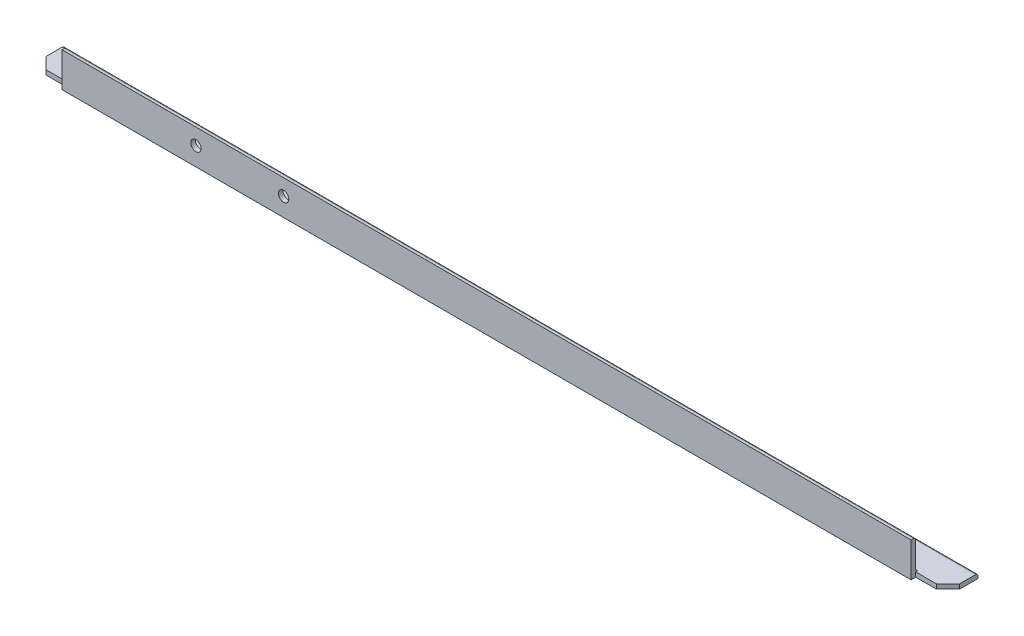
ISO-10303-21;
HEADER;
FILE_DESCRIPTION(('STEP AP214'),'2;1');
FILE_NAME('part.step','',(''),(''),'','','');
FILE_SCHEMA(('AUTOMOTIVE_DESIGN { 1 0 10303 214 1 1 1 1 }'));
ENDSEC;
DATA;
#1=APPLICATION_CONTEXT('core data for automotive mechanical design processes');
#2=APPLICATION_PROTOCOL_DEFINITION('international standard','automotive_design',2000,#1);
#3=PRODUCT_CONTEXT('',#1,'mechanical');
#4=PRODUCT('Part','Part','',(#3));
#5=PRODUCT_RELATED_PRODUCT_CATEGORY('part','',(#4));
#6=PRODUCT_DEFINITION_FORMATION('','',#4);
#7=PRODUCT_DEFINITION_CONTEXT('part definition',#1,'design');
#8=PRODUCT_DEFINITION('design','',#6,#7);
#9=PRODUCT_DEFINITION_SHAPE('','',#8);
#10=(LENGTH_UNIT() NAMED_UNIT(*) SI_UNIT(.MILLI.,.METRE.));
#11=(NAMED_UNIT(*) PLANE_ANGLE_UNIT() SI_UNIT($,.RADIAN.));
#12=(NAMED_UNIT(*) SI_UNIT($,.STERADIAN.) SOLID_ANGLE_UNIT());
#13=UNCERTAINTY_MEASURE_WITH_UNIT(LENGTH_MEASURE(1.E-05),#10,'distance_accuracy_value','');
#14=(GEOMETRIC_REPRESENTATION_CONTEXT(3) GLOBAL_UNCERTAINTY_ASSIGNED_CONTEXT((#13)) GLOBAL_UNIT_ASSIGNED_CONTEXT((#10,
#11,#12)) REPRESENTATION_CONTEXT('',''));
#15=CARTESIAN_POINT('',(0.,0.,0.));
#16=DIRECTION('',(0.,0.,1.));
#17=DIRECTION('',(1.,0.,0.));
#18=AXIS2_PLACEMENT_3D('',#15,#16,#17);
#19=CARTESIAN_POINT('',(396.,3.,-3.));
#20=DIRECTION('',(-1.,0.,0.));
#21=DIRECTION('',(0.,0.,1.));
#22=AXIS2_PLACEMENT_3D('',#19,#20,#21);
#23=CYLINDRICAL_SURFACE('',#22,1.);
#24=DIRECTION('',(-1.,0.,0.));
#25=VECTOR('',#24,1.);
#26=CARTESIAN_POINT('',(396.,2.,-3.));
#27=LINE('',#26,#25);
#28=CARTESIAN_POINT('',(382.,2.,-3.00000000000001));
#29=VERTEX_POINT('',#28);
#30=CARTESIAN_POINT('',(14.,2.,-3.));
#31=VERTEX_POINT('',#30);
#32=EDGE_CURVE('E194',#29,#31,#27,.T.);
#33=ORIENTED_EDGE('',*,*,#32,.T.);
#34=CARTESIAN_POINT('',(14.,3.,-3.));
#35=DIRECTION('',(1.,0.,0.));
#36=DIRECTION('',(0.,0.,-1.));
#37=AXIS2_PLACEMENT_3D('',#34,#35,#36);
#38=CIRCLE('',#37,1.);
#39=CARTESIAN_POINT('',(14.,3.,-2.));
#40=VERTEX_POINT('',#39);
#41=EDGE_CURVE('E262',#31,#40,#38,.F.);
#42=ORIENTED_EDGE('',*,*,#41,.T.);
#43=DIRECTION('',(-1.,0.,0.));
#44=VECTOR('',#43,1.);
#45=CARTESIAN_POINT('',(396.,3.,-2.));
#46=LINE('',#45,#44);
#47=CARTESIAN_POINT('',(382.,3.,-2.));
#48=VERTEX_POINT('',#47);
#49=EDGE_CURVE('E191',#48,#40,#46,.T.);
#50=ORIENTED_EDGE('',*,*,#49,.F.);
#51=CARTESIAN_POINT('',(382.,3.,-3.));
#52=DIRECTION('',(1.,0.,0.));
#53=DIRECTION('',(0.,0.,-1.));
#54=AXIS2_PLACEMENT_3D('',#51,#52,#53);
#55=CIRCLE('',#54,1.);
#56=EDGE_CURVE('E169',#29,#48,#55,.F.);
#57=ORIENTED_EDGE('',*,*,#56,.F.);
#58=EDGE_LOOP('',(#33,#42,#50,#57));
#59=FACE_BOUND('',#58,.T.);
#60=ADVANCED_FACE('F33',(#59),#23,.F.);
#61=CARTESIAN_POINT('',(396.,14.,-2.));
#62=DIRECTION('',(0.,0.,1.));
#63=DIRECTION('',(0.,-1.,0.));
#64=AXIS2_PLACEMENT_3D('',#61,#62,#63);
#65=PLANE('',#64);
#66=CARTESIAN_POINT('',(110.,8.,-2.));
#67=DIRECTION('',(0.,0.,-1.));
#68=DIRECTION('',(0.,1.,0.));
#69=AXIS2_PLACEMENT_3D('',#66,#67,#68);
#70=CIRCLE('',#69,2.25);
#71=CARTESIAN_POINT('',(110.,10.25,-2.));
#72=VERTEX_POINT('',#71);
#73=EDGE_CURVE('E520',#72,#72,#70,.T.);
#74=ORIENTED_EDGE('',*,*,#73,.F.);
#75=EDGE_LOOP('',(#74));
#76=FACE_BOUND('',#75,.T.);
#77=CARTESIAN_POINT('',(72.,8.,-2.));
#78=DIRECTION('',(0.,0.,-1.));
#79=DIRECTION('',(0.,1.,0.));
#80=AXIS2_PLACEMENT_3D('',#77,#78,#79);
#81=CIRCLE('',#80,2.25);
#82=CARTESIAN_POINT('',(72.,10.25,-2.));
#83=VERTEX_POINT('',#82);
#84=EDGE_CURVE('E522',#83,#83,#81,.T.);
#85=ORIENTED_EDGE('',*,*,#84,.F.);
#86=EDGE_LOOP('',(#85));
#87=FACE_BOUND('',#86,.T.);
#88=ORIENTED_EDGE('',*,*,#49,.T.);
#89=DIRECTION('',(0.,1.,0.));
#90=VECTOR('',#89,1.);
#91=CARTESIAN_POINT('',(14.,14.,-2.));
#92=LINE('',#91,#90);
#93=CARTESIAN_POINT('',(14.,14.,-2.));
#94=VERTEX_POINT('',#93);
#95=EDGE_CURVE('E267',#40,#94,#92,.T.);
#96=ORIENTED_EDGE('',*,*,#95,.T.);
#97=DIRECTION('',(-1.,0.,0.));
#98=VECTOR('',#97,1.);
#99=CARTESIAN_POINT('',(396.,14.,-2.));
#100=LINE('',#99,#98);
#101=CARTESIAN_POINT('',(382.,14.,-2.));
#102=VERTEX_POINT('',#101);
#103=EDGE_CURVE('E188',#102,#94,#100,.T.);
#104=ORIENTED_EDGE('',*,*,#103,.F.);
#105=DIRECTION('',(0.,1.,0.));
#106=VECTOR('',#105,1.);
#107=CARTESIAN_POINT('',(382.,14.,-2.));
#108=LINE('',#107,#106);
#109=EDGE_CURVE('E244',#48,#102,#108,.T.);
#110=ORIENTED_EDGE('',*,*,#109,.F.);
#111=EDGE_LOOP('',(#88,#96,#104,#110));
#112=FACE_BOUND('',#111,.T.);
#113=ADVANCED_FACE('F259',(#76,#87,#112),#65,.F.);
#114=CARTESIAN_POINT('',(396.,14.,-1.));
#115=DIRECTION('',(-1.,0.,0.));
#116=DIRECTION('',(0.,0.,1.));
#117=AXIS2_PLACEMENT_3D('',#114,#115,#116);
#118=CYLINDRICAL_SURFACE('',#117,1.);
#119=ORIENTED_EDGE('',*,*,#103,.T.);
#120=CARTESIAN_POINT('',(14.,14.,-1.));
#121=DIRECTION('',(1.,0.,0.));
#122=DIRECTION('',(0.,0.,-1.));
#123=AXIS2_PLACEMENT_3D('',#120,#121,#122);
#124=CIRCLE('',#123,1.);
#125=CARTESIAN_POINT('',(14.,15.,-1.));
#126=VERTEX_POINT('',#125);
#127=EDGE_CURVE('E271',#94,#126,#124,.T.);
#128=ORIENTED_EDGE('',*,*,#127,.T.);
#129=DIRECTION('',(-1.,0.,0.));
#130=VECTOR('',#129,1.);
#131=CARTESIAN_POINT('',(396.,15.,-1.));
#132=LINE('',#131,#130);
#133=CARTESIAN_POINT('',(382.,15.,-1.));
#134=VERTEX_POINT('',#133);
#135=EDGE_CURVE('E185',#134,#126,#132,.T.);
#136=ORIENTED_EDGE('',*,*,#135,.F.);
#137=CARTESIAN_POINT('',(382.,14.,-1.));
#138=DIRECTION('',(1.,0.,0.));
#139=DIRECTION('',(0.,0.,-1.));
#140=AXIS2_PLACEMENT_3D('',#137,#138,#139);
#141=CIRCLE('',#140,1.);
#142=EDGE_CURVE('E241',#102,#134,#141,.T.);
#143=ORIENTED_EDGE('',*,*,#142,.F.);
#144=EDGE_LOOP('',(#119,#128,#136,#143));
#145=FACE_BOUND('',#144,.T.);
#146=ADVANCED_FACE('F311',(#145),#118,.T.);
#147=CARTESIAN_POINT('',(396.,15.,0.));
#148=DIRECTION('',(0.,-1.,0.));
#149=DIRECTION('',(0.,0.,-1.));
#150=AXIS2_PLACEMENT_3D('',#147,#148,#149);
#151=PLANE('',#150);
#152=ORIENTED_EDGE('',*,*,#135,.T.);
#153=DIRECTION('',(0.,0.,-1.));
#154=VECTOR('',#153,1.);
#155=CARTESIAN_POINT('',(14.,15.,0.));
#156=LINE('',#155,#154);
#157=CARTESIAN_POINT('',(14.,15.,0.));
#158=VERTEX_POINT('',#157);
#159=EDGE_CURVE('E290',#158,#126,#156,.T.);
#160=ORIENTED_EDGE('',*,*,#159,.F.);
#161=DIRECTION('',(-1.,0.,0.));
#162=VECTOR('',#161,1.);
#163=CARTESIAN_POINT('',(396.,15.,0.));
#164=LINE('',#163,#162);
#165=CARTESIAN_POINT('',(382.,15.,0.));
#166=VERTEX_POINT('',#165);
#167=EDGE_CURVE('E182',#166,#158,#164,.T.);
#168=ORIENTED_EDGE('',*,*,#167,.F.);
#169=DIRECTION('',(0.,0.,1.));
#170=VECTOR('',#169,1.);
#171=CARTESIAN_POINT('',(382.,15.,-3.00000000000001));
#172=LINE('',#171,#170);
#173=EDGE_CURVE('E246',#134,#166,#172,.T.);
#174=ORIENTED_EDGE('',*,*,#173,.F.);
#175=EDGE_LOOP('',(#152,#160,#168,#174));
#176=FACE_BOUND('',#175,.T.);
#177=ADVANCED_FACE('F289',(#176),#151,.F.);
#178=CARTESIAN_POINT('',(396.,0.,0.));
#179=DIRECTION('',(0.,0.,-1.));
#180=DIRECTION('',(-1.,0.,0.));
#181=AXIS2_PLACEMENT_3D('',#178,#179,#180);
#182=PLANE('',#181);
#183=CARTESIAN_POINT('',(110.,8.,0.));
#184=DIRECTION('',(0.,0.,-1.));
#185=DIRECTION('',(0.,1.,0.));
#186=AXIS2_PLACEMENT_3D('',#183,#184,#185);
#187=CIRCLE('',#186,2.25);
#188=CARTESIAN_POINT('',(110.,10.25,0.));
#189=VERTEX_POINT('',#188);
#190=EDGE_CURVE('E517',#189,#189,#187,.T.);
#191=ORIENTED_EDGE('',*,*,#190,.T.);
#192=EDGE_LOOP('',(#191));
#193=FACE_BOUND('',#192,.T.);
#194=CARTESIAN_POINT('',(72.,8.,0.));
#195=DIRECTION('',(0.,0.,-1.));
#196=DIRECTION('',(0.,1.,0.));
#197=AXIS2_PLACEMENT_3D('',#194,#195,#196);
#198=CIRCLE('',#197,2.25);
#199=CARTESIAN_POINT('',(72.,10.25,0.));
#200=VERTEX_POINT('',#199);
#201=EDGE_CURVE('E525',#200,#200,#198,.T.);
#202=ORIENTED_EDGE('',*,*,#201,.T.);
#203=EDGE_LOOP('',(#202));
#204=FACE_BOUND('',#203,.T.);
#205=ORIENTED_EDGE('',*,*,#167,.T.);
#206=DIRECTION('',(0.,1.,0.));
#207=VECTOR('',#206,1.);
#208=CARTESIAN_POINT('',(14.,15.,0.));
#209=LINE('',#208,#207);
#210=CARTESIAN_POINT('',(14.,0.,0.));
#211=VERTEX_POINT('',#210);
#212=EDGE_CURVE('E293',#211,#158,#209,.T.);
#213=ORIENTED_EDGE('',*,*,#212,.F.);
#214=DIRECTION('',(-1.,0.,0.));
#215=VECTOR('',#214,1.);
#216=CARTESIAN_POINT('',(396.,0.,0.));
#217=LINE('',#216,#215);
#218=CARTESIAN_POINT('',(382.,0.,0.));
#219=VERTEX_POINT('',#218);
#220=EDGE_CURVE('E174',#219,#211,#217,.T.);
#221=ORIENTED_EDGE('',*,*,#220,.F.);
#222=DIRECTION('',(0.,-1.,0.));
#223=VECTOR('',#222,1.);
#224=CARTESIAN_POINT('',(382.,15.,0.));
#225=LINE('',#224,#223);
#226=EDGE_CURVE('E266',#166,#219,#225,.T.);
#227=ORIENTED_EDGE('',*,*,#226,.F.);
#228=EDGE_LOOP('',(#205,#213,#221,#227));
#229=FACE_BOUND('',#228,.T.);
#230=ADVANCED_FACE('F286',(#193,#204,#229),#182,.F.);
#231=CARTESIAN_POINT('',(396.,0.,0.));
#232=DIRECTION('',(0.,1.,0.));
#233=DIRECTION('',(0.,0.,1.));
#234=AXIS2_PLACEMENT_3D('',#231,#232,#233);
#235=PLANE('',#234);
#236=CARTESIAN_POINT('',(198.,0.,-8.));
#237=DIRECTION('',(0.,1.,0.));
#238=DIRECTION('',(0.,0.,1.));
#239=AXIS2_PLACEMENT_3D('',#236,#237,#238);
#240=CIRCLE('',#239,4.30000000000002);
#241=CARTESIAN_POINT('',(198.,0.,-3.69999999999998));
#242=VERTEX_POINT('',#241);
#243=EDGE_CURVE('E11',#242,#242,#240,.T.);
#244=ORIENTED_EDGE('',*,*,#243,.T.);
#245=EDGE_LOOP('',(#244));
#246=FACE_BOUND('',#245,.T.);
#247=CARTESIAN_POINT('',(25.,0.,-8.));
#248=DIRECTION('',(0.,1.,0.));
#249=DIRECTION('',(0.,0.,1.));
#250=AXIS2_PLACEMENT_3D('',#247,#248,#249);
#251=CIRCLE('',#250,4.30000000000001);
#252=CARTESIAN_POINT('',(25.,0.,-3.69999999999999));
#253=VERTEX_POINT('',#252);
#254=EDGE_CURVE('E41',#253,#253,#251,.T.);
#255=ORIENTED_EDGE('',*,*,#254,.T.);
#256=EDGE_LOOP('',(#255));
#257=FACE_BOUND('',#256,.T.);
#258=CARTESIAN_POINT('',(371.,0.,-8.));
#259=DIRECTION('',(0.,1.,0.));
#260=DIRECTION('',(0.,0.,1.));
#261=AXIS2_PLACEMENT_3D('',#258,#259,#260);
#262=CIRCLE('',#261,4.29999999999997);
#263=CARTESIAN_POINT('',(371.,0.,-3.70000000000003));
#264=VERTEX_POINT('',#263);
#265=EDGE_CURVE('E213',#264,#264,#262,.T.);
#266=ORIENTED_EDGE('',*,*,#265,.T.);
#267=EDGE_LOOP('',(#266));
#268=FACE_BOUND('',#267,.T.);
#269=DIRECTION('',(0.,0.,-1.));
#270=VECTOR('',#269,1.);
#271=CARTESIAN_POINT('',(396.,0.,0.));
#272=LINE('',#271,#270);
#273=CARTESIAN_POINT('',(396.,0.,-7.));
#274=VERTEX_POINT('',#273);
#275=CARTESIAN_POINT('',(396.,0.,-15.));
#276=VERTEX_POINT('',#275);
#277=EDGE_CURVE('E151',#274,#276,#272,.T.);
#278=ORIENTED_EDGE('',*,*,#277,.F.);
#279=DIRECTION('',(-0.707106781186548,0.,0.707106781186547));
#280=VECTOR('',#279,1.);
#281=CARTESIAN_POINT('',(396.,0.,-7.));
#282=LINE('',#281,#280);
#283=CARTESIAN_POINT('',(391.,0.,-2.));
#284=VERTEX_POINT('',#283);
#285=EDGE_CURVE('E138',#274,#284,#282,.T.);
#286=ORIENTED_EDGE('',*,*,#285,.T.);
#287=DIRECTION('',(1.,0.,0.));
#288=VECTOR('',#287,1.);
#289=CARTESIAN_POINT('',(382.,0.,-2.));
#290=LINE('',#289,#288);
#291=CARTESIAN_POINT('',(382.,0.,-2.));
#292=VERTEX_POINT('',#291);
#293=EDGE_CURVE('E242',#292,#284,#290,.T.);
#294=ORIENTED_EDGE('',*,*,#293,.F.);
#295=DIRECTION('',(0.,0.,-1.));
#296=VECTOR('',#295,1.);
#297=CARTESIAN_POINT('',(382.,0.,0.));
#298=LINE('',#297,#296);
#299=EDGE_CURVE('E269',#219,#292,#298,.T.);
#300=ORIENTED_EDGE('',*,*,#299,.F.);
#301=ORIENTED_EDGE('',*,*,#220,.T.);
#302=DIRECTION('',(0.,0.,1.));
#303=VECTOR('',#302,1.);
#304=CARTESIAN_POINT('',(14.,0.,0.));
#305=LINE('',#304,#303);
#306=CARTESIAN_POINT('',(14.,0.,-2.));
#307=VERTEX_POINT('',#306);
#308=EDGE_CURVE('E303',#307,#211,#305,.T.);
#309=ORIENTED_EDGE('',*,*,#308,.F.);
#310=DIRECTION('',(-1.,0.,0.));
#311=VECTOR('',#310,1.);
#312=CARTESIAN_POINT('',(14.,0.,-2.));
#313=LINE('',#312,#311);
#314=CARTESIAN_POINT('',(5.,0.,-2.));
#315=VERTEX_POINT('',#314);
#316=EDGE_CURVE('E306',#307,#315,#313,.T.);
#317=ORIENTED_EDGE('',*,*,#316,.T.);
#318=DIRECTION('',(-0.707106781186548,0.,-0.707106781186547));
#319=VECTOR('',#318,1.);
#320=CARTESIAN_POINT('',(0.,0.,-7.));
#321=LINE('',#320,#319);
#322=CARTESIAN_POINT('',(0.,0.,-7.));
#323=VERTEX_POINT('',#322);
#324=EDGE_CURVE('E56',#315,#323,#321,.T.);
#325=ORIENTED_EDGE('',*,*,#324,.T.);
#326=DIRECTION('',(0.,0.,-1.));
#327=VECTOR('',#326,1.);
#328=CARTESIAN_POINT('',(0.,0.,0.));
#329=LINE('',#328,#327);
#330=CARTESIAN_POINT('',(0.,0.,-15.));
#331=VERTEX_POINT('',#330);
#332=EDGE_CURVE('E175',#323,#331,#329,.T.);
#333=ORIENTED_EDGE('',*,*,#332,.T.);
#334=DIRECTION('',(-1.,0.,0.));
#335=VECTOR('',#334,1.);
#336=CARTESIAN_POINT('',(396.,0.,-15.));
#337=LINE('',#336,#335);
#338=EDGE_CURVE('E159',#276,#331,#337,.T.);
#339=ORIENTED_EDGE('',*,*,#338,.F.);
#340=EDGE_LOOP('',(#278,#286,#294,#300,#301,#309,#317,#325,#333,#339));
#341=FACE_BOUND('',#340,.T.);
#342=ADVANCED_FACE('F157',(#246,#257,#268,#341),#235,.F.);
#343=CARTESIAN_POINT('',(396.,1.,-15.));
#344=DIRECTION('',(0.,0.,1.));
#345=DIRECTION('',(1.,0.,0.));
#346=AXIS2_PLACEMENT_3D('',#343,#344,#345);
#347=PLANE('',#346);
#348=DIRECTION('',(0.,1.,0.));
#349=VECTOR('',#348,1.);
#350=CARTESIAN_POINT('',(0.,1.,-15.));
#351=LINE('',#350,#349);
#352=CARTESIAN_POINT('',(0.,1.,-15.));
#353=VERTEX_POINT('',#352);
#354=EDGE_CURVE('E177',#331,#353,#351,.T.);
#355=ORIENTED_EDGE('',*,*,#354,.T.);
#356=DIRECTION('',(-1.,0.,0.));
#357=VECTOR('',#356,1.);
#358=CARTESIAN_POINT('',(396.,1.,-15.));
#359=LINE('',#358,#357);
#360=CARTESIAN_POINT('',(396.,1.,-15.));
#361=VERTEX_POINT('',#360);
#362=EDGE_CURVE('E200',#361,#353,#359,.T.);
#363=ORIENTED_EDGE('',*,*,#362,.F.);
#364=DIRECTION('',(0.,1.,0.));
#365=VECTOR('',#364,1.);
#366=CARTESIAN_POINT('',(396.,1.,-15.));
#367=LINE('',#366,#365);
#368=EDGE_CURVE('E160',#276,#361,#367,.T.);
#369=ORIENTED_EDGE('',*,*,#368,.F.);
#370=ORIENTED_EDGE('',*,*,#338,.T.);
#371=EDGE_LOOP('',(#355,#363,#369,#370));
#372=FACE_BOUND('',#371,.T.);
#373=ADVANCED_FACE('F337',(#372),#347,.F.);
#374=CARTESIAN_POINT('',(396.,1.,-14.));
#375=DIRECTION('',(-1.,0.,0.));
#376=DIRECTION('',(0.,0.,1.));
#377=AXIS2_PLACEMENT_3D('',#374,#375,#376);
#378=CYLINDRICAL_SURFACE('',#377,1.);
#379=CARTESIAN_POINT('',(0.,1.,-14.));
#380=DIRECTION('',(1.,0.,0.));
#381=DIRECTION('',(0.,0.,1.));
#382=AXIS2_PLACEMENT_3D('',#379,#380,#381);
#383=CIRCLE('',#382,1.);
#384=CARTESIAN_POINT('',(0.,2.,-14.));
#385=VERTEX_POINT('',#384);
#386=EDGE_CURVE('E166',#353,#385,#383,.T.);
#387=ORIENTED_EDGE('',*,*,#386,.T.);
#388=DIRECTION('',(-1.,0.,0.));
#389=VECTOR('',#388,1.);
#390=CARTESIAN_POINT('',(396.,2.,-14.));
#391=LINE('',#390,#389);
#392=CARTESIAN_POINT('',(396.,2.,-14.));
#393=VERTEX_POINT('',#392);
#394=EDGE_CURVE('E197',#393,#385,#391,.T.);
#395=ORIENTED_EDGE('',*,*,#394,.F.);
#396=CARTESIAN_POINT('',(396.,1.,-14.));
#397=DIRECTION('',(1.,0.,0.));
#398=DIRECTION('',(0.,0.,1.));
#399=AXIS2_PLACEMENT_3D('',#396,#397,#398);
#400=CIRCLE('',#399,1.);
#401=EDGE_CURVE('E163',#361,#393,#400,.T.);
#402=ORIENTED_EDGE('',*,*,#401,.F.);
#403=ORIENTED_EDGE('',*,*,#362,.T.);
#404=EDGE_LOOP('',(#387,#395,#402,#403));
#405=FACE_BOUND('',#404,.T.);
#406=ADVANCED_FACE('F229',(#405),#378,.T.);
#407=CARTESIAN_POINT('',(396.,2.,-3.));
#408=DIRECTION('',(0.,-1.,0.));
#409=DIRECTION('',(0.,0.,-1.));
#410=AXIS2_PLACEMENT_3D('',#407,#408,#409);
#411=PLANE('',#410);
#412=CARTESIAN_POINT('',(198.,2.,-8.));
#413=DIRECTION('',(0.,-1.,0.));
#414=DIRECTION('',(0.,0.,-1.));
#415=AXIS2_PLACEMENT_3D('',#412,#413,#414);
#416=CIRCLE('',#415,2.30000000000004);
#417=CARTESIAN_POINT('',(198.,2.,-10.3));
#418=VERTEX_POINT('',#417);
#419=EDGE_CURVE('E210',#418,#418,#416,.T.);
#420=ORIENTED_EDGE('',*,*,#419,.T.);
#421=EDGE_LOOP('',(#420));
#422=FACE_BOUND('',#421,.T.);
#423=CARTESIAN_POINT('',(25.,2.,-8.));
#424=DIRECTION('',(0.,-1.,0.));
#425=DIRECTION('',(0.,0.,-1.));
#426=AXIS2_PLACEMENT_3D('',#423,#424,#425);
#427=CIRCLE('',#426,2.30000000000003);
#428=CARTESIAN_POINT('',(25.,2.,-10.3));
#429=VERTEX_POINT('',#428);
#430=EDGE_CURVE('E207',#429,#429,#427,.T.);
#431=ORIENTED_EDGE('',*,*,#430,.T.);
#432=EDGE_LOOP('',(#431));
#433=FACE_BOUND('',#432,.T.);
#434=CARTESIAN_POINT('',(371.,2.,-8.));
#435=DIRECTION('',(0.,-1.,0.));
#436=DIRECTION('',(0.,0.,-1.));
#437=AXIS2_PLACEMENT_3D('',#434,#435,#436);
#438=CIRCLE('',#437,2.29999999999999);
#439=CARTESIAN_POINT('',(371.,2.,-10.3));
#440=VERTEX_POINT('',#439);
#441=EDGE_CURVE('E204',#440,#440,#438,.T.);
#442=ORIENTED_EDGE('',*,*,#441,.T.);
#443=EDGE_LOOP('',(#442));
#444=FACE_BOUND('',#443,.T.);
#445=DIRECTION('',(1.,0.,0.));
#446=VECTOR('',#445,1.);
#447=CARTESIAN_POINT('',(382.,2.,-2.));
#448=LINE('',#447,#446);
#449=CARTESIAN_POINT('',(382.,2.,-2.));
#450=VERTEX_POINT('',#449);
#451=CARTESIAN_POINT('',(391.,2.,-2.));
#452=VERTEX_POINT('',#451);
#453=EDGE_CURVE('E236',#450,#452,#448,.T.);
#454=ORIENTED_EDGE('',*,*,#453,.T.);
#455=DIRECTION('',(-0.707106781186548,0.,0.707106781186547));
#456=VECTOR('',#455,1.);
#457=CARTESIAN_POINT('',(396.,2.,-7.));
#458=LINE('',#457,#456);
#459=CARTESIAN_POINT('',(396.,2.,-7.));
#460=VERTEX_POINT('',#459);
#461=EDGE_CURVE('E48',#460,#452,#458,.T.);
#462=ORIENTED_EDGE('',*,*,#461,.F.);
#463=DIRECTION('',(0.,0.,1.));
#464=VECTOR('',#463,1.);
#465=CARTESIAN_POINT('',(396.,2.,-3.));
#466=LINE('',#465,#464);
#467=EDGE_CURVE('E154',#393,#460,#466,.T.);
#468=ORIENTED_EDGE('',*,*,#467,.F.);
#469=ORIENTED_EDGE('',*,*,#394,.T.);
#470=DIRECTION('',(0.,0.,1.));
#471=VECTOR('',#470,1.);
#472=CARTESIAN_POINT('',(0.,2.,-3.));
#473=LINE('',#472,#471);
#474=CARTESIAN_POINT('',(0.,2.,-7.));
#475=VERTEX_POINT('',#474);
#476=EDGE_CURVE('E161',#385,#475,#473,.T.);
#477=ORIENTED_EDGE('',*,*,#476,.T.);
#478=DIRECTION('',(-0.707106781186548,0.,-0.707106781186547));
#479=VECTOR('',#478,1.);
#480=CARTESIAN_POINT('',(0.,2.,-7.));
#481=LINE('',#480,#479);
#482=CARTESIAN_POINT('',(5.,2.,-2.));
#483=VERTEX_POINT('',#482);
#484=EDGE_CURVE('E531',#483,#475,#481,.T.);
#485=ORIENTED_EDGE('',*,*,#484,.F.);
#486=DIRECTION('',(-1.,0.,0.));
#487=VECTOR('',#486,1.);
#488=CARTESIAN_POINT('',(14.,2.,-2.));
#489=LINE('',#488,#487);
#490=CARTESIAN_POINT('',(14.,2.,-2.));
#491=VERTEX_POINT('',#490);
#492=EDGE_CURVE('E305',#491,#483,#489,.T.);
#493=ORIENTED_EDGE('',*,*,#492,.F.);
#494=DIRECTION('',(0.,0.,1.));
#495=VECTOR('',#494,1.);
#496=CARTESIAN_POINT('',(14.,2.,-3.));
#497=LINE('',#496,#495);
#498=EDGE_CURVE('E292',#31,#491,#497,.T.);
#499=ORIENTED_EDGE('',*,*,#498,.F.);
#500=ORIENTED_EDGE('',*,*,#32,.F.);
#501=DIRECTION('',(0.,0.,-1.));
#502=VECTOR('',#501,1.);
#503=CARTESIAN_POINT('',(382.,2.,-2.));
#504=LINE('',#503,#502);
#505=EDGE_CURVE('E238',#450,#29,#504,.T.);
#506=ORIENTED_EDGE('',*,*,#505,.F.);
#507=EDGE_LOOP('',(#454,#462,#468,#469,#477,#485,#493,#499,#500,#506));
#508=FACE_BOUND('',#507,.T.);
#509=ADVANCED_FACE('F226',(#422,#433,#444,#508),#411,.F.);
#510=CARTESIAN_POINT('',(396.,1.,-14.));
#511=DIRECTION('',(-1.,0.,0.));
#512=DIRECTION('',(0.,0.,1.));
#513=AXIS2_PLACEMENT_3D('',#510,#511,#512);
#514=PLANE('',#513);
#515=ORIENTED_EDGE('',*,*,#467,.T.);
#516=DIRECTION('',(0.,1.,0.));
#517=VECTOR('',#516,1.);
#518=CARTESIAN_POINT('',(396.,0.,-7.));
#519=LINE('',#518,#517);
#520=EDGE_CURVE('E141',#274,#460,#519,.T.);
#521=ORIENTED_EDGE('',*,*,#520,.F.);
#522=ORIENTED_EDGE('',*,*,#277,.T.);
#523=ORIENTED_EDGE('',*,*,#368,.T.);
#524=ORIENTED_EDGE('',*,*,#401,.T.);
#525=EDGE_LOOP('',(#515,#521,#522,#523,#524));
#526=FACE_BOUND('',#525,.T.);
#527=ADVANCED_FACE('F150',(#526),#514,.F.);
#528=CARTESIAN_POINT('',(0.,1.,-14.));
#529=DIRECTION('',(-1.,0.,0.));
#530=DIRECTION('',(0.,0.,1.));
#531=AXIS2_PLACEMENT_3D('',#528,#529,#530);
#532=PLANE('',#531);
#533=DIRECTION('',(0.,1.,0.));
#534=VECTOR('',#533,1.);
#535=CARTESIAN_POINT('',(0.,0.,-7.));
#536=LINE('',#535,#534);
#537=EDGE_CURVE('E297',#323,#475,#536,.T.);
#538=ORIENTED_EDGE('',*,*,#537,.T.);
#539=ORIENTED_EDGE('',*,*,#476,.F.);
#540=ORIENTED_EDGE('',*,*,#386,.F.);
#541=ORIENTED_EDGE('',*,*,#354,.F.);
#542=ORIENTED_EDGE('',*,*,#332,.F.);
#543=EDGE_LOOP('',(#538,#539,#540,#541,#542));
#544=FACE_BOUND('',#543,.T.);
#545=ADVANCED_FACE('F346',(#544),#532,.T.);
#546=CARTESIAN_POINT('',(198.,2.05000000000004,-8.));
#547=DIRECTION('',(0.,-1.,0.));
#548=DIRECTION('',(0.,0.,-1.));
#549=AXIS2_PLACEMENT_3D('',#546,#547,#548);
#550=CONICAL_SURFACE('',#549,2.25000000000001,0.785398163397443);
#551=ORIENTED_EDGE('',*,*,#243,.F.);
#552=EDGE_LOOP('',(#551));
#553=FACE_BOUND('',#552,.T.);
#554=ORIENTED_EDGE('',*,*,#419,.F.);
#555=EDGE_LOOP('',(#554));
#556=FACE_BOUND('',#555,.T.);
#557=ADVANCED_FACE('F223',(#553,#556),#550,.F.);
#558=CARTESIAN_POINT('',(25.,2.05000000000004,-8.));
#559=DIRECTION('',(0.,-1.,0.));
#560=DIRECTION('',(0.,0.,-1.));
#561=AXIS2_PLACEMENT_3D('',#558,#559,#560);
#562=CONICAL_SURFACE('',#561,2.25,0.785398163397443);
#563=ORIENTED_EDGE('',*,*,#254,.F.);
#564=EDGE_LOOP('',(#563));
#565=FACE_BOUND('',#564,.T.);
#566=ORIENTED_EDGE('',*,*,#430,.F.);
#567=EDGE_LOOP('',(#566));
#568=FACE_BOUND('',#567,.T.);
#569=ADVANCED_FACE('F220',(#565,#568),#562,.F.);
#570=CARTESIAN_POINT('',(371.,2.05000000000004,-8.));
#571=DIRECTION('',(0.,-1.,0.));
#572=DIRECTION('',(0.,0.,-1.));
#573=AXIS2_PLACEMENT_3D('',#570,#571,#572);
#574=CONICAL_SURFACE('',#573,2.24999999999995,0.785398163397443);
#575=ORIENTED_EDGE('',*,*,#265,.F.);
#576=EDGE_LOOP('',(#575));
#577=FACE_BOUND('',#576,.T.);
#578=ORIENTED_EDGE('',*,*,#441,.F.);
#579=EDGE_LOOP('',(#578));
#580=FACE_BOUND('',#579,.T.);
#581=ADVANCED_FACE('F35',(#577,#580),#574,.F.);
#582=CARTESIAN_POINT('',(382.,0.,0.));
#583=DIRECTION('',(1.,0.,0.));
#584=DIRECTION('',(0.,0.,-1.));
#585=AXIS2_PLACEMENT_3D('',#582,#583,#584);
#586=PLANE('',#585);
#587=ORIENTED_EDGE('',*,*,#56,.T.);
#588=ORIENTED_EDGE('',*,*,#109,.T.);
#589=ORIENTED_EDGE('',*,*,#142,.T.);
#590=ORIENTED_EDGE('',*,*,#173,.T.);
#591=ORIENTED_EDGE('',*,*,#226,.T.);
#592=ORIENTED_EDGE('',*,*,#299,.T.);
#593=DIRECTION('',(0.,1.,0.));
#594=VECTOR('',#593,1.);
#595=CARTESIAN_POINT('',(382.,0.,-2.));
#596=LINE('',#595,#594);
#597=EDGE_CURVE('E277',#292,#450,#596,.T.);
#598=ORIENTED_EDGE('',*,*,#597,.T.);
#599=ORIENTED_EDGE('',*,*,#505,.T.);
#600=EDGE_LOOP('',(#587,#588,#589,#590,#591,#592,#598,#599));
#601=FACE_BOUND('',#600,.T.);
#602=ADVANCED_FACE('F254',(#601),#586,.T.);
#603=CARTESIAN_POINT('',(382.,0.,-2.));
#604=DIRECTION('',(0.,0.,-1.));
#605=DIRECTION('',(-1.,0.,0.));
#606=AXIS2_PLACEMENT_3D('',#603,#604,#605);
#607=PLANE('',#606);
#608=ORIENTED_EDGE('',*,*,#293,.T.);
#609=DIRECTION('',(0.,1.,0.));
#610=VECTOR('',#609,1.);
#611=CARTESIAN_POINT('',(391.,0.,-2.));
#612=LINE('',#611,#610);
#613=EDGE_CURVE('E142',#284,#452,#612,.T.);
#614=ORIENTED_EDGE('',*,*,#613,.T.);
#615=ORIENTED_EDGE('',*,*,#453,.F.);
#616=ORIENTED_EDGE('',*,*,#597,.F.);
#617=EDGE_LOOP('',(#608,#614,#615,#616));
#618=FACE_BOUND('',#617,.T.);
#619=ADVANCED_FACE('F315',(#618),#607,.F.);
#620=CARTESIAN_POINT('',(14.,0.,0.));
#621=DIRECTION('',(1.,0.,0.));
#622=DIRECTION('',(0.,0.,-1.));
#623=AXIS2_PLACEMENT_3D('',#620,#621,#622);
#624=PLANE('',#623);
#625=ORIENTED_EDGE('',*,*,#498,.T.);
#626=DIRECTION('',(0.,-1.,0.));
#627=VECTOR('',#626,1.);
#628=CARTESIAN_POINT('',(14.,2.,-2.));
#629=LINE('',#628,#627);
#630=EDGE_CURVE('E295',#491,#307,#629,.T.);
#631=ORIENTED_EDGE('',*,*,#630,.T.);
#632=ORIENTED_EDGE('',*,*,#308,.T.);
#633=ORIENTED_EDGE('',*,*,#212,.T.);
#634=ORIENTED_EDGE('',*,*,#159,.T.);
#635=ORIENTED_EDGE('',*,*,#127,.F.);
#636=ORIENTED_EDGE('',*,*,#95,.F.);
#637=ORIENTED_EDGE('',*,*,#41,.F.);
#638=EDGE_LOOP('',(#625,#631,#632,#633,#634,#635,#636,#637));
#639=FACE_BOUND('',#638,.T.);
#640=ADVANCED_FACE('F312',(#639),#624,.F.);
#641=CARTESIAN_POINT('',(14.,2.,-2.));
#642=DIRECTION('',(0.,0.,-1.));
#643=DIRECTION('',(-1.,0.,0.));
#644=AXIS2_PLACEMENT_3D('',#641,#642,#643);
#645=PLANE('',#644);
#646=ORIENTED_EDGE('',*,*,#492,.T.);
#647=DIRECTION('',(0.,1.,0.));
#648=VECTOR('',#647,1.);
#649=CARTESIAN_POINT('',(5.,0.,-2.));
#650=LINE('',#649,#648);
#651=EDGE_CURVE('E534',#315,#483,#650,.T.);
#652=ORIENTED_EDGE('',*,*,#651,.F.);
#653=ORIENTED_EDGE('',*,*,#316,.F.);
#654=ORIENTED_EDGE('',*,*,#630,.F.);
#655=EDGE_LOOP('',(#646,#652,#653,#654));
#656=FACE_BOUND('',#655,.T.);
#657=ADVANCED_FACE('F314',(#656),#645,.F.);
#658=CARTESIAN_POINT('',(0.,0.,-7.));
#659=DIRECTION('',(0.707106781186547,0.,-0.707106781186548));
#660=DIRECTION('',(-0.707106781186548,0.,-0.707106781186547));
#661=AXIS2_PLACEMENT_3D('',#658,#659,#660);
#662=PLANE('',#661);
#663=ORIENTED_EDGE('',*,*,#484,.T.);
#664=ORIENTED_EDGE('',*,*,#537,.F.);
#665=ORIENTED_EDGE('',*,*,#324,.F.);
#666=ORIENTED_EDGE('',*,*,#651,.T.);
#667=EDGE_LOOP('',(#663,#664,#665,#666));
#668=FACE_BOUND('',#667,.T.);
#669=ADVANCED_FACE('F321',(#668),#662,.F.);
#670=CARTESIAN_POINT('',(396.,0.,-7.));
#671=DIRECTION('',(-0.707106781186547,0.,-0.707106781186548));
#672=DIRECTION('',(-0.707106781186548,0.,0.707106781186547));
#673=AXIS2_PLACEMENT_3D('',#670,#671,#672);
#674=PLANE('',#673);
#675=ORIENTED_EDGE('',*,*,#461,.T.);
#676=ORIENTED_EDGE('',*,*,#613,.F.);
#677=ORIENTED_EDGE('',*,*,#285,.F.);
#678=ORIENTED_EDGE('',*,*,#520,.T.);
#679=EDGE_LOOP('',(#675,#676,#677,#678));
#680=FACE_BOUND('',#679,.T.);
#681=ADVANCED_FACE('F140',(#680),#674,.F.);
#682=CARTESIAN_POINT('',(72.,8.,0.));
#683=DIRECTION('',(0.,0.,-1.));
#684=DIRECTION('',(0.,1.,0.));
#685=AXIS2_PLACEMENT_3D('',#682,#683,#684);
#686=CYLINDRICAL_SURFACE('',#685,2.25);
#687=ORIENTED_EDGE('',*,*,#201,.F.);
#688=EDGE_LOOP('',(#687));
#689=FACE_BOUND('',#688,.T.);
#690=ORIENTED_EDGE('',*,*,#84,.T.);
#691=EDGE_LOOP('',(#690));
#692=FACE_BOUND('',#691,.T.);
#693=ADVANCED_FACE('F436',(#689,#692),#686,.F.);
#694=CARTESIAN_POINT('',(110.,8.,0.));
#695=DIRECTION('',(0.,0.,-1.));
#696=DIRECTION('',(0.,1.,0.));
#697=AXIS2_PLACEMENT_3D('',#694,#695,#696);
#698=CYLINDRICAL_SURFACE('',#697,2.25);
#699=ORIENTED_EDGE('',*,*,#190,.F.);
#700=EDGE_LOOP('',(#699));
#701=FACE_BOUND('',#700,.T.);
#702=ORIENTED_EDGE('',*,*,#73,.T.);
#703=EDGE_LOOP('',(#702));
#704=FACE_BOUND('',#703,.T.);
#705=ADVANCED_FACE('F500',(#701,#704),#698,.F.);
#706=CLOSED_SHELL('',(#60,#113,#146,#177,#230,#342,#373,#406,#509,#527,#545,#557,#569,#581,#602,
#619,#640,#657,#669,#681,#693,#705));
#707=MANIFOLD_SOLID_BREP('B2',#706);
#708=ADVANCED_BREP_SHAPE_REPRESENTATION('',(#18,#707),#14);
#709=SHAPE_DEFINITION_REPRESENTATION(#9,#708);
ENDSEC;
END-ISO-10303-21;
